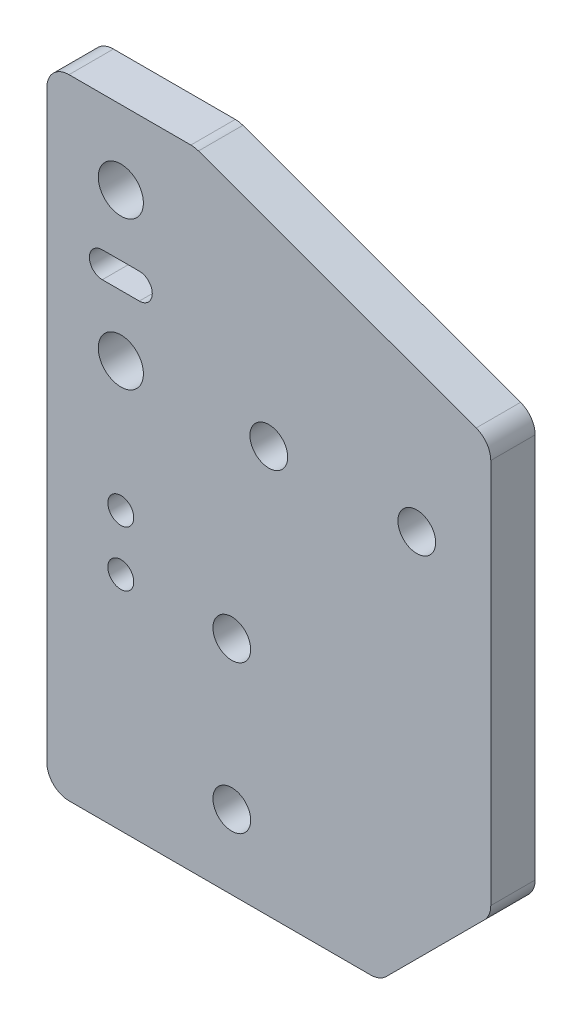
ISO-10303-21;
HEADER;
FILE_DESCRIPTION(('STEP AP214'),'2;1');
FILE_NAME('part.step','',(''),(''),'','','');
FILE_SCHEMA(('AUTOMOTIVE_DESIGN { 1 0 10303 214 1 1 1 1 }'));
ENDSEC;
DATA;
#1=APPLICATION_CONTEXT('core data for automotive mechanical design processes');
#2=APPLICATION_PROTOCOL_DEFINITION('international standard','automotive_design',2000,#1);
#3=PRODUCT_CONTEXT('',#1,'mechanical');
#4=PRODUCT('Part','Part','',(#3));
#5=PRODUCT_RELATED_PRODUCT_CATEGORY('part','',(#4));
#6=PRODUCT_DEFINITION_FORMATION('','',#4);
#7=PRODUCT_DEFINITION_CONTEXT('part definition',#1,'design');
#8=PRODUCT_DEFINITION('design','',#6,#7);
#9=PRODUCT_DEFINITION_SHAPE('','',#8);
#10=(LENGTH_UNIT() NAMED_UNIT(*) SI_UNIT(.MILLI.,.METRE.));
#11=(NAMED_UNIT(*) PLANE_ANGLE_UNIT() SI_UNIT($,.RADIAN.));
#12=(NAMED_UNIT(*) SI_UNIT($,.STERADIAN.) SOLID_ANGLE_UNIT());
#13=UNCERTAINTY_MEASURE_WITH_UNIT(LENGTH_MEASURE(1.E-05),#10,'distance_accuracy_value','');
#14=(GEOMETRIC_REPRESENTATION_CONTEXT(3) GLOBAL_UNCERTAINTY_ASSIGNED_CONTEXT((#13)) GLOBAL_UNIT_ASSIGNED_CONTEXT((#10,
#11,#12)) REPRESENTATION_CONTEXT('',''));
#15=CARTESIAN_POINT('',(0.,0.,0.));
#16=DIRECTION('',(0.,0.,1.));
#17=DIRECTION('',(1.,0.,0.));
#18=AXIS2_PLACEMENT_3D('',#15,#16,#17);
#19=CARTESIAN_POINT('',(57.,16.2426406871195,0.));
#20=DIRECTION('',(0.,0.,-1.));
#21=DIRECTION('',(-1.,0.,0.));
#22=AXIS2_PLACEMENT_3D('',#19,#20,#21);
#23=PLANE('',#22);
#24=CARTESIAN_POINT('',(25.,9.99999999999999,0.));
#25=DIRECTION('',(0.,0.,1.));
#26=DIRECTION('',(1.,0.,0.));
#27=AXIS2_PLACEMENT_3D('',#24,#25,#26);
#28=CIRCLE('',#27,2.55);
#29=CARTESIAN_POINT('',(27.55,9.99999999999999,0.));
#30=VERTEX_POINT('',#29);
#31=EDGE_CURVE('E569',#30,#30,#28,.T.);
#32=ORIENTED_EDGE('',*,*,#31,.T.);
#33=EDGE_LOOP('',(#32));
#34=FACE_BOUND('',#33,.T.);
#35=CARTESIAN_POINT('',(50.,55.,0.));
#36=DIRECTION('',(0.,0.,1.));
#37=DIRECTION('',(1.,0.,0.));
#38=AXIS2_PLACEMENT_3D('',#35,#36,#37);
#39=CIRCLE('',#38,2.55);
#40=CARTESIAN_POINT('',(52.55,55.,0.));
#41=VERTEX_POINT('',#40);
#42=EDGE_CURVE('E594',#41,#41,#39,.T.);
#43=ORIENTED_EDGE('',*,*,#42,.T.);
#44=EDGE_LOOP('',(#43));
#45=FACE_BOUND('',#44,.T.);
#46=DIRECTION('',(1.,0.,0.));
#47=VECTOR('',#46,1.);
#48=CARTESIAN_POINT('',(12.5,63.25,0.));
#49=LINE('',#48,#47);
#50=CARTESIAN_POINT('',(7.49999999999999,63.25,0.));
#51=VERTEX_POINT('',#50);
#52=CARTESIAN_POINT('',(12.5,63.25,0.));
#53=VERTEX_POINT('',#52);
#54=EDGE_CURVE('E156',#51,#53,#49,.T.);
#55=ORIENTED_EDGE('',*,*,#54,.T.);
#56=CARTESIAN_POINT('',(12.5,65.,0.));
#57=DIRECTION('',(0.,0.,1.));
#58=DIRECTION('',(1.,0.,0.));
#59=AXIS2_PLACEMENT_3D('',#56,#57,#58);
#60=CIRCLE('',#59,1.75);
#61=CARTESIAN_POINT('',(12.5,66.75,0.));
#62=VERTEX_POINT('',#61);
#63=EDGE_CURVE('E57',#53,#62,#60,.T.);
#64=ORIENTED_EDGE('',*,*,#63,.T.);
#65=DIRECTION('',(-1.,0.,0.));
#66=VECTOR('',#65,1.);
#67=CARTESIAN_POINT('',(12.5,66.75,0.));
#68=LINE('',#67,#66);
#69=CARTESIAN_POINT('',(7.49999999999999,66.75,0.));
#70=VERTEX_POINT('',#69);
#71=EDGE_CURVE('E162',#62,#70,#68,.T.);
#72=ORIENTED_EDGE('',*,*,#71,.T.);
#73=CARTESIAN_POINT('',(7.49999999999999,65.,0.));
#74=DIRECTION('',(0.,0.,1.));
#75=DIRECTION('',(1.,0.,0.));
#76=AXIS2_PLACEMENT_3D('',#73,#74,#75);
#77=CIRCLE('',#76,1.75);
#78=EDGE_CURVE('E179',#70,#51,#77,.T.);
#79=ORIENTED_EDGE('',*,*,#78,.T.);
#80=EDGE_LOOP('',(#55,#64,#72,#79));
#81=FACE_BOUND('',#80,.T.);
#82=CARTESIAN_POINT('',(10.,55.,0.));
#83=DIRECTION('',(0.,0.,1.));
#84=DIRECTION('',(1.,0.,0.));
#85=AXIS2_PLACEMENT_3D('',#82,#83,#84);
#86=CIRCLE('',#85,3.05);
#87=CARTESIAN_POINT('',(13.05,55.,0.));
#88=VERTEX_POINT('',#87);
#89=EDGE_CURVE('E163',#88,#88,#86,.T.);
#90=ORIENTED_EDGE('',*,*,#89,.T.);
#91=EDGE_LOOP('',(#90));
#92=FACE_BOUND('',#91,.T.);
#93=CARTESIAN_POINT('',(57.,16.2426406871195,0.));
#94=DIRECTION('',(0.,0.,1.));
#95=DIRECTION('',(-1.,0.,0.));
#96=AXIS2_PLACEMENT_3D('',#93,#94,#95);
#97=CIRCLE('',#96,2.99999999999999);
#98=CARTESIAN_POINT('',(59.1213203435597,14.1213203435598,0.));
#99=VERTEX_POINT('',#98);
#100=CARTESIAN_POINT('',(60.,16.2426406871195,0.));
#101=VERTEX_POINT('',#100);
#102=EDGE_CURVE('E196',#99,#101,#97,.T.);
#103=ORIENTED_EDGE('',*,*,#102,.F.);
#104=DIRECTION('',(0.707106781186543,0.707106781186551,0.));
#105=VECTOR('',#104,1.);
#106=CARTESIAN_POINT('',(59.1213203435597,14.1213203435598,0.));
#107=LINE('',#106,#105);
#108=CARTESIAN_POINT('',(45.8786796564404,0.87867965644037,0.));
#109=VERTEX_POINT('',#108);
#110=EDGE_CURVE('E203',#109,#99,#107,.T.);
#111=ORIENTED_EDGE('',*,*,#110,.F.);
#112=CARTESIAN_POINT('',(43.7573593128807,3.,0.));
#113=DIRECTION('',(0.,0.,1.));
#114=DIRECTION('',(-1.,0.,0.));
#115=AXIS2_PLACEMENT_3D('',#112,#113,#114);
#116=CIRCLE('',#115,3.);
#117=CARTESIAN_POINT('',(43.7573593128807,0.,0.));
#118=VERTEX_POINT('',#117);
#119=EDGE_CURVE('E246',#118,#109,#116,.T.);
#120=ORIENTED_EDGE('',*,*,#119,.F.);
#121=DIRECTION('',(1.,0.,0.));
#122=VECTOR('',#121,1.);
#123=CARTESIAN_POINT('',(3.00000000000002,0.,0.));
#124=LINE('',#123,#122);
#125=CARTESIAN_POINT('',(3.00000000000002,0.,0.));
#126=VERTEX_POINT('',#125);
#127=EDGE_CURVE('E244',#126,#118,#124,.T.);
#128=ORIENTED_EDGE('',*,*,#127,.F.);
#129=CARTESIAN_POINT('',(3.,3.,0.));
#130=DIRECTION('',(0.,0.,1.));
#131=DIRECTION('',(1.,0.,0.));
#132=AXIS2_PLACEMENT_3D('',#129,#130,#131);
#133=CIRCLE('',#132,3.);
#134=CARTESIAN_POINT('',(0.,3.00000000000002,0.));
#135=VERTEX_POINT('',#134);
#136=EDGE_CURVE('E242',#135,#126,#133,.T.);
#137=ORIENTED_EDGE('',*,*,#136,.F.);
#138=DIRECTION('',(0.,-1.,0.));
#139=VECTOR('',#138,1.);
#140=CARTESIAN_POINT('',(0.,3.00000000000002,0.));
#141=LINE('',#140,#139);
#142=CARTESIAN_POINT('',(0.,82.,0.));
#143=VERTEX_POINT('',#142);
#144=EDGE_CURVE('E240',#143,#135,#141,.T.);
#145=ORIENTED_EDGE('',*,*,#144,.F.);
#146=CARTESIAN_POINT('',(3.,82.,0.));
#147=DIRECTION('',(0.,0.,1.));
#148=DIRECTION('',(-1.,0.,0.));
#149=AXIS2_PLACEMENT_3D('',#146,#147,#148);
#150=CIRCLE('',#149,3.);
#151=CARTESIAN_POINT('',(3.,85.,0.));
#152=VERTEX_POINT('',#151);
#153=EDGE_CURVE('E238',#152,#143,#150,.T.);
#154=ORIENTED_EDGE('',*,*,#153,.F.);
#155=DIRECTION('',(-1.,0.,0.));
#156=VECTOR('',#155,1.);
#157=CARTESIAN_POINT('',(3.,85.,0.));
#158=LINE('',#157,#156);
#159=CARTESIAN_POINT('',(19.4710190578746,85.,0.));
#160=VERTEX_POINT('',#159);
#161=EDGE_CURVE('E236',#160,#152,#158,.T.);
#162=ORIENTED_EDGE('',*,*,#161,.F.);
#163=CARTESIAN_POINT('',(19.4710190578746,82.,0.));
#164=DIRECTION('',(0.,0.,1.));
#165=DIRECTION('',(1.,0.,0.));
#166=AXIS2_PLACEMENT_3D('',#163,#164,#165);
#167=CIRCLE('',#166,3.00000000000001);
#168=CARTESIAN_POINT('',(20.4970794878516,84.8190778623577,0.));
#169=VERTEX_POINT('',#168);
#170=EDGE_CURVE('E234',#169,#160,#167,.T.);
#171=ORIENTED_EDGE('',*,*,#170,.F.);
#172=DIRECTION('',(-0.939692620785909,0.342020143325666,0.));
#173=VECTOR('',#172,1.);
#174=CARTESIAN_POINT('',(58.026060429977,71.1596458770806,0.));
#175=LINE('',#174,#173);
#176=CARTESIAN_POINT('',(58.026060429977,71.1596458770806,0.));
#177=VERTEX_POINT('',#176);
#178=EDGE_CURVE('E232',#177,#169,#175,.T.);
#179=ORIENTED_EDGE('',*,*,#178,.F.);
#180=CARTESIAN_POINT('',(57.,68.3405680147229,0.));
#181=DIRECTION('',(0.,0.,1.));
#182=DIRECTION('',(-1.,0.,0.));
#183=AXIS2_PLACEMENT_3D('',#180,#181,#182);
#184=CIRCLE('',#183,3.);
#185=CARTESIAN_POINT('',(60.,68.3405680147229,0.));
#186=VERTEX_POINT('',#185);
#187=EDGE_CURVE('E230',#186,#177,#184,.T.);
#188=ORIENTED_EDGE('',*,*,#187,.F.);
#189=DIRECTION('',(0.,1.,0.));
#190=VECTOR('',#189,1.);
#191=CARTESIAN_POINT('',(60.,16.2426406871195,0.));
#192=LINE('',#191,#190);
#193=EDGE_CURVE('E228',#101,#186,#192,.T.);
#194=ORIENTED_EDGE('',*,*,#193,.F.);
#195=EDGE_LOOP('',(#103,#111,#120,#128,#137,#145,#154,#162,#171,#179,#188,#194));
#196=FACE_BOUND('',#195,.T.);
#197=CARTESIAN_POINT('',(9.99999999999999,75.,0.));
#198=DIRECTION('',(0.,0.,1.));
#199=DIRECTION('',(1.,0.,0.));
#200=AXIS2_PLACEMENT_3D('',#197,#198,#199);
#201=CIRCLE('',#200,3.05);
#202=CARTESIAN_POINT('',(13.05,75.,0.));
#203=VERTEX_POINT('',#202);
#204=EDGE_CURVE('E190',#203,#203,#201,.T.);
#205=ORIENTED_EDGE('',*,*,#204,.T.);
#206=EDGE_LOOP('',(#205));
#207=FACE_BOUND('',#206,.T.);
#208=CARTESIAN_POINT('',(30.,55.,0.));
#209=DIRECTION('',(0.,0.,1.));
#210=DIRECTION('',(1.,0.,0.));
#211=AXIS2_PLACEMENT_3D('',#208,#209,#210);
#212=CIRCLE('',#211,2.55);
#213=CARTESIAN_POINT('',(32.55,55.,0.));
#214=VERTEX_POINT('',#213);
#215=EDGE_CURVE('E598',#214,#214,#212,.T.);
#216=ORIENTED_EDGE('',*,*,#215,.T.);
#217=EDGE_LOOP('',(#216));
#218=FACE_BOUND('',#217,.T.);
#219=CARTESIAN_POINT('',(10.,30.,0.));
#220=DIRECTION('',(0.,0.,-1.));
#221=DIRECTION('',(-1.,0.,0.));
#222=AXIS2_PLACEMENT_3D('',#219,#220,#221);
#223=CIRCLE('',#222,1.75);
#224=CARTESIAN_POINT('',(8.25,30.,0.));
#225=VERTEX_POINT('',#224);
#226=EDGE_CURVE('E588',#225,#225,#223,.T.);
#227=ORIENTED_EDGE('',*,*,#226,.F.);
#228=EDGE_LOOP('',(#227));
#229=FACE_BOUND('',#228,.T.);
#230=CARTESIAN_POINT('',(10.,37.5,0.));
#231=DIRECTION('',(0.,0.,-1.));
#232=DIRECTION('',(-1.,0.,0.));
#233=AXIS2_PLACEMENT_3D('',#230,#231,#232);
#234=CIRCLE('',#233,1.75);
#235=CARTESIAN_POINT('',(8.25,37.5,0.));
#236=VERTEX_POINT('',#235);
#237=EDGE_CURVE('E582',#236,#236,#234,.T.);
#238=ORIENTED_EDGE('',*,*,#237,.F.);
#239=EDGE_LOOP('',(#238));
#240=FACE_BOUND('',#239,.T.);
#241=CARTESIAN_POINT('',(25.,30.,0.));
#242=DIRECTION('',(0.,0.,1.));
#243=DIRECTION('',(1.,0.,0.));
#244=AXIS2_PLACEMENT_3D('',#241,#242,#243);
#245=CIRCLE('',#244,2.55);
#246=CARTESIAN_POINT('',(27.55,30.,0.));
#247=VERTEX_POINT('',#246);
#248=EDGE_CURVE('E579',#247,#247,#245,.T.);
#249=ORIENTED_EDGE('',*,*,#248,.T.);
#250=EDGE_LOOP('',(#249));
#251=FACE_BOUND('',#250,.T.);
#252=ADVANCED_FACE('F34',(#34,#45,#81,#92,#196,#207,#218,#229,#240,#251),#23,.T.);
#253=CARTESIAN_POINT('',(57.,16.2426406871195,6.));
#254=DIRECTION('',(0.,0.,-1.));
#255=DIRECTION('',(-1.,0.,0.));
#256=AXIS2_PLACEMENT_3D('',#253,#254,#255);
#257=PLANE('',#256);
#258=CARTESIAN_POINT('',(25.,9.99999999999999,6.));
#259=DIRECTION('',(0.,0.,1.));
#260=DIRECTION('',(1.,0.,0.));
#261=AXIS2_PLACEMENT_3D('',#258,#259,#260);
#262=CIRCLE('',#261,2.55);
#263=CARTESIAN_POINT('',(27.55,9.99999999999999,6.));
#264=VERTEX_POINT('',#263);
#265=EDGE_CURVE('E572',#264,#264,#262,.T.);
#266=ORIENTED_EDGE('',*,*,#265,.F.);
#267=EDGE_LOOP('',(#266));
#268=FACE_BOUND('',#267,.T.);
#269=CARTESIAN_POINT('',(25.,30.,6.));
#270=DIRECTION('',(0.,0.,1.));
#271=DIRECTION('',(1.,0.,0.));
#272=AXIS2_PLACEMENT_3D('',#269,#270,#271);
#273=CIRCLE('',#272,2.55);
#274=CARTESIAN_POINT('',(27.55,30.,6.));
#275=VERTEX_POINT('',#274);
#276=EDGE_CURVE('E574',#275,#275,#273,.T.);
#277=ORIENTED_EDGE('',*,*,#276,.F.);
#278=EDGE_LOOP('',(#277));
#279=FACE_BOUND('',#278,.T.);
#280=CARTESIAN_POINT('',(10.,37.5,6.));
#281=DIRECTION('',(0.,0.,-1.));
#282=DIRECTION('',(-1.,0.,0.));
#283=AXIS2_PLACEMENT_3D('',#280,#281,#282);
#284=CIRCLE('',#283,1.75);
#285=CARTESIAN_POINT('',(8.25,37.5,6.));
#286=VERTEX_POINT('',#285);
#287=EDGE_CURVE('E585',#286,#286,#284,.T.);
#288=ORIENTED_EDGE('',*,*,#287,.T.);
#289=EDGE_LOOP('',(#288));
#290=FACE_BOUND('',#289,.T.);
#291=CARTESIAN_POINT('',(10.,30.,6.));
#292=DIRECTION('',(0.,0.,-1.));
#293=DIRECTION('',(-1.,0.,0.));
#294=AXIS2_PLACEMENT_3D('',#291,#292,#293);
#295=CIRCLE('',#294,1.75);
#296=CARTESIAN_POINT('',(8.25,30.,6.));
#297=VERTEX_POINT('',#296);
#298=EDGE_CURVE('E591',#297,#297,#295,.T.);
#299=ORIENTED_EDGE('',*,*,#298,.T.);
#300=EDGE_LOOP('',(#299));
#301=FACE_BOUND('',#300,.T.);
#302=CARTESIAN_POINT('',(10.,55.,6.));
#303=DIRECTION('',(0.,0.,1.));
#304=DIRECTION('',(1.,0.,0.));
#305=AXIS2_PLACEMENT_3D('',#302,#303,#304);
#306=CIRCLE('',#305,3.05);
#307=CARTESIAN_POINT('',(13.05,55.,6.));
#308=VERTEX_POINT('',#307);
#309=EDGE_CURVE('E187',#308,#308,#306,.T.);
#310=ORIENTED_EDGE('',*,*,#309,.F.);
#311=EDGE_LOOP('',(#310));
#312=FACE_BOUND('',#311,.T.);
#313=CARTESIAN_POINT('',(9.99999999999999,75.,6.));
#314=DIRECTION('',(0.,0.,1.));
#315=DIRECTION('',(1.,0.,0.));
#316=AXIS2_PLACEMENT_3D('',#313,#314,#315);
#317=CIRCLE('',#316,3.05);
#318=CARTESIAN_POINT('',(13.05,75.,6.));
#319=VERTEX_POINT('',#318);
#320=EDGE_CURVE('E193',#319,#319,#317,.T.);
#321=ORIENTED_EDGE('',*,*,#320,.F.);
#322=EDGE_LOOP('',(#321));
#323=FACE_BOUND('',#322,.T.);
#324=CARTESIAN_POINT('',(57.,16.2426406871195,6.));
#325=DIRECTION('',(0.,0.,1.));
#326=DIRECTION('',(-1.,0.,0.));
#327=AXIS2_PLACEMENT_3D('',#324,#325,#326);
#328=CIRCLE('',#327,2.99999999999999);
#329=CARTESIAN_POINT('',(59.1213203435597,14.1213203435598,6.));
#330=VERTEX_POINT('',#329);
#331=CARTESIAN_POINT('',(60.,16.2426406871195,6.));
#332=VERTEX_POINT('',#331);
#333=EDGE_CURVE('E199',#330,#332,#328,.T.);
#334=ORIENTED_EDGE('',*,*,#333,.T.);
#335=DIRECTION('',(0.,1.,0.));
#336=VECTOR('',#335,1.);
#337=CARTESIAN_POINT('',(60.,16.2426406871195,6.));
#338=LINE('',#337,#336);
#339=CARTESIAN_POINT('',(60.,68.3405680147229,6.));
#340=VERTEX_POINT('',#339);
#341=EDGE_CURVE('E202',#332,#340,#338,.T.);
#342=ORIENTED_EDGE('',*,*,#341,.T.);
#343=CARTESIAN_POINT('',(57.,68.3405680147229,6.));
#344=DIRECTION('',(0.,0.,1.));
#345=DIRECTION('',(-1.,0.,0.));
#346=AXIS2_PLACEMENT_3D('',#343,#344,#345);
#347=CIRCLE('',#346,3.);
#348=CARTESIAN_POINT('',(58.026060429977,71.1596458770806,6.));
#349=VERTEX_POINT('',#348);
#350=EDGE_CURVE('E205',#340,#349,#347,.T.);
#351=ORIENTED_EDGE('',*,*,#350,.T.);
#352=DIRECTION('',(-0.939692620785909,0.342020143325666,0.));
#353=VECTOR('',#352,1.);
#354=CARTESIAN_POINT('',(58.026060429977,71.1596458770806,6.));
#355=LINE('',#354,#353);
#356=CARTESIAN_POINT('',(20.4970794878516,84.8190778623577,6.));
#357=VERTEX_POINT('',#356);
#358=EDGE_CURVE('E207',#349,#357,#355,.T.);
#359=ORIENTED_EDGE('',*,*,#358,.T.);
#360=CARTESIAN_POINT('',(19.4710190578746,82.,6.));
#361=DIRECTION('',(0.,0.,1.));
#362=DIRECTION('',(1.,0.,0.));
#363=AXIS2_PLACEMENT_3D('',#360,#361,#362);
#364=CIRCLE('',#363,3.00000000000001);
#365=CARTESIAN_POINT('',(19.4710190578746,85.,6.));
#366=VERTEX_POINT('',#365);
#367=EDGE_CURVE('E209',#357,#366,#364,.T.);
#368=ORIENTED_EDGE('',*,*,#367,.T.);
#369=DIRECTION('',(-1.,0.,0.));
#370=VECTOR('',#369,1.);
#371=CARTESIAN_POINT('',(3.,85.,6.));
#372=LINE('',#371,#370);
#373=CARTESIAN_POINT('',(3.,85.,6.));
#374=VERTEX_POINT('',#373);
#375=EDGE_CURVE('E211',#366,#374,#372,.T.);
#376=ORIENTED_EDGE('',*,*,#375,.T.);
#377=CARTESIAN_POINT('',(3.,82.,6.));
#378=DIRECTION('',(0.,0.,1.));
#379=DIRECTION('',(-1.,0.,0.));
#380=AXIS2_PLACEMENT_3D('',#377,#378,#379);
#381=CIRCLE('',#380,3.);
#382=CARTESIAN_POINT('',(0.,82.,6.));
#383=VERTEX_POINT('',#382);
#384=EDGE_CURVE('E213',#374,#383,#381,.T.);
#385=ORIENTED_EDGE('',*,*,#384,.T.);
#386=DIRECTION('',(0.,-1.,0.));
#387=VECTOR('',#386,1.);
#388=CARTESIAN_POINT('',(0.,3.00000000000002,6.));
#389=LINE('',#388,#387);
#390=CARTESIAN_POINT('',(0.,3.00000000000002,6.));
#391=VERTEX_POINT('',#390);
#392=EDGE_CURVE('E215',#383,#391,#389,.T.);
#393=ORIENTED_EDGE('',*,*,#392,.T.);
#394=CARTESIAN_POINT('',(3.,3.,6.));
#395=DIRECTION('',(0.,0.,1.));
#396=DIRECTION('',(1.,0.,0.));
#397=AXIS2_PLACEMENT_3D('',#394,#395,#396);
#398=CIRCLE('',#397,3.);
#399=CARTESIAN_POINT('',(3.00000000000002,0.,6.));
#400=VERTEX_POINT('',#399);
#401=EDGE_CURVE('E217',#391,#400,#398,.T.);
#402=ORIENTED_EDGE('',*,*,#401,.T.);
#403=DIRECTION('',(1.,0.,0.));
#404=VECTOR('',#403,1.);
#405=CARTESIAN_POINT('',(3.00000000000002,0.,6.));
#406=LINE('',#405,#404);
#407=CARTESIAN_POINT('',(43.7573593128807,0.,6.));
#408=VERTEX_POINT('',#407);
#409=EDGE_CURVE('E219',#400,#408,#406,.T.);
#410=ORIENTED_EDGE('',*,*,#409,.T.);
#411=CARTESIAN_POINT('',(43.7573593128807,3.,6.));
#412=DIRECTION('',(0.,0.,1.));
#413=DIRECTION('',(-1.,0.,0.));
#414=AXIS2_PLACEMENT_3D('',#411,#412,#413);
#415=CIRCLE('',#414,3.);
#416=CARTESIAN_POINT('',(45.8786796564404,0.87867965644037,6.));
#417=VERTEX_POINT('',#416);
#418=EDGE_CURVE('E221',#408,#417,#415,.T.);
#419=ORIENTED_EDGE('',*,*,#418,.T.);
#420=DIRECTION('',(0.707106781186543,0.707106781186551,0.));
#421=VECTOR('',#420,1.);
#422=CARTESIAN_POINT('',(59.1213203435597,14.1213203435598,6.));
#423=LINE('',#422,#421);
#424=EDGE_CURVE('E223',#417,#330,#423,.T.);
#425=ORIENTED_EDGE('',*,*,#424,.T.);
#426=EDGE_LOOP('',(#334,#342,#351,#359,#368,#376,#385,#393,#402,#410,#419,#425));
#427=FACE_BOUND('',#426,.T.);
#428=CARTESIAN_POINT('',(12.5,65.,6.));
#429=DIRECTION('',(0.,0.,1.));
#430=DIRECTION('',(1.,0.,0.));
#431=AXIS2_PLACEMENT_3D('',#428,#429,#430);
#432=CIRCLE('',#431,1.75);
#433=CARTESIAN_POINT('',(12.5,63.25,6.));
#434=VERTEX_POINT('',#433);
#435=CARTESIAN_POINT('',(12.5,66.75,6.));
#436=VERTEX_POINT('',#435);
#437=EDGE_CURVE('E147',#434,#436,#432,.T.);
#438=ORIENTED_EDGE('',*,*,#437,.F.);
#439=DIRECTION('',(1.,0.,0.));
#440=VECTOR('',#439,1.);
#441=CARTESIAN_POINT('',(12.5,63.25,6.));
#442=LINE('',#441,#440);
#443=CARTESIAN_POINT('',(7.49999999999999,63.25,6.));
#444=VERTEX_POINT('',#443);
#445=EDGE_CURVE('E171',#444,#434,#442,.T.);
#446=ORIENTED_EDGE('',*,*,#445,.F.);
#447=CARTESIAN_POINT('',(7.49999999999999,65.,6.));
#448=DIRECTION('',(0.,0.,1.));
#449=DIRECTION('',(1.,0.,0.));
#450=AXIS2_PLACEMENT_3D('',#447,#448,#449);
#451=CIRCLE('',#450,1.75);
#452=CARTESIAN_POINT('',(7.49999999999999,66.75,6.));
#453=VERTEX_POINT('',#452);
#454=EDGE_CURVE('E169',#453,#444,#451,.T.);
#455=ORIENTED_EDGE('',*,*,#454,.F.);
#456=DIRECTION('',(-1.,0.,0.));
#457=VECTOR('',#456,1.);
#458=CARTESIAN_POINT('',(12.5,66.75,6.));
#459=LINE('',#458,#457);
#460=EDGE_CURVE('E155',#436,#453,#459,.T.);
#461=ORIENTED_EDGE('',*,*,#460,.F.);
#462=EDGE_LOOP('',(#438,#446,#455,#461));
#463=FACE_BOUND('',#462,.T.);
#464=CARTESIAN_POINT('',(30.,55.,6.));
#465=DIRECTION('',(0.,0.,1.));
#466=DIRECTION('',(1.,0.,0.));
#467=AXIS2_PLACEMENT_3D('',#464,#465,#466);
#468=CIRCLE('',#467,2.55);
#469=CARTESIAN_POINT('',(32.55,55.,6.));
#470=VERTEX_POINT('',#469);
#471=EDGE_CURVE('E177',#470,#470,#468,.T.);
#472=ORIENTED_EDGE('',*,*,#471,.F.);
#473=EDGE_LOOP('',(#472));
#474=FACE_BOUND('',#473,.T.);
#475=CARTESIAN_POINT('',(50.,55.,6.));
#476=DIRECTION('',(0.,0.,1.));
#477=DIRECTION('',(1.,0.,0.));
#478=AXIS2_PLACEMENT_3D('',#475,#476,#477);
#479=CIRCLE('',#478,2.55);
#480=CARTESIAN_POINT('',(52.55,55.,6.));
#481=VERTEX_POINT('',#480);
#482=EDGE_CURVE('E595',#481,#481,#479,.T.);
#483=ORIENTED_EDGE('',*,*,#482,.F.);
#484=EDGE_LOOP('',(#483));
#485=FACE_BOUND('',#484,.T.);
#486=ADVANCED_FACE('F167',(#268,#279,#290,#301,#312,#323,#427,#463,#474,#485),#257,.F.);
#487=CARTESIAN_POINT('',(57.,16.2426406871195,6.));
#488=DIRECTION('',(0.,0.,-1.));
#489=DIRECTION('',(-1.,0.,0.));
#490=AXIS2_PLACEMENT_3D('',#487,#488,#489);
#491=CYLINDRICAL_SURFACE('',#490,2.99999999999999);
#492=ORIENTED_EDGE('',*,*,#102,.T.);
#493=DIRECTION('',(0.,0.,-1.));
#494=VECTOR('',#493,1.);
#495=CARTESIAN_POINT('',(60.,16.2426406871195,6.));
#496=LINE('',#495,#494);
#497=EDGE_CURVE('E11',#332,#101,#496,.T.);
#498=ORIENTED_EDGE('',*,*,#497,.F.);
#499=ORIENTED_EDGE('',*,*,#333,.F.);
#500=DIRECTION('',(0.,0.,-1.));
#501=VECTOR('',#500,1.);
#502=CARTESIAN_POINT('',(59.1213203435597,14.1213203435598,6.));
#503=LINE('',#502,#501);
#504=EDGE_CURVE('E225',#330,#99,#503,.T.);
#505=ORIENTED_EDGE('',*,*,#504,.T.);
#506=EDGE_LOOP('',(#492,#498,#499,#505));
#507=FACE_BOUND('',#506,.T.);
#508=ADVANCED_FACE('F36',(#507),#491,.T.);
#509=CARTESIAN_POINT('',(60.,16.2426406871195,6.));
#510=DIRECTION('',(-1.,0.,0.));
#511=DIRECTION('',(0.,-1.,0.));
#512=AXIS2_PLACEMENT_3D('',#509,#510,#511);
#513=PLANE('',#512);
#514=ORIENTED_EDGE('',*,*,#193,.T.);
#515=DIRECTION('',(0.,0.,-1.));
#516=VECTOR('',#515,1.);
#517=CARTESIAN_POINT('',(60.,68.3405680147229,6.));
#518=LINE('',#517,#516);
#519=EDGE_CURVE('E42',#340,#186,#518,.T.);
#520=ORIENTED_EDGE('',*,*,#519,.F.);
#521=ORIENTED_EDGE('',*,*,#341,.F.);
#522=ORIENTED_EDGE('',*,*,#497,.T.);
#523=EDGE_LOOP('',(#514,#520,#521,#522));
#524=FACE_BOUND('',#523,.T.);
#525=ADVANCED_FACE('F304',(#524),#513,.F.);
#526=CARTESIAN_POINT('',(57.,68.3405680147229,6.));
#527=DIRECTION('',(0.,0.,-1.));
#528=DIRECTION('',(-1.,0.,0.));
#529=AXIS2_PLACEMENT_3D('',#526,#527,#528);
#530=CYLINDRICAL_SURFACE('',#529,3.);
#531=ORIENTED_EDGE('',*,*,#187,.T.);
#532=DIRECTION('',(0.,0.,-1.));
#533=VECTOR('',#532,1.);
#534=CARTESIAN_POINT('',(58.026060429977,71.1596458770806,6.));
#535=LINE('',#534,#533);
#536=EDGE_CURVE('E275',#349,#177,#535,.T.);
#537=ORIENTED_EDGE('',*,*,#536,.F.);
#538=ORIENTED_EDGE('',*,*,#350,.F.);
#539=ORIENTED_EDGE('',*,*,#519,.T.);
#540=EDGE_LOOP('',(#531,#537,#538,#539));
#541=FACE_BOUND('',#540,.T.);
#542=ADVANCED_FACE('F282',(#541),#530,.T.);
#543=CARTESIAN_POINT('',(58.026060429977,71.1596458770806,6.));
#544=DIRECTION('',(-0.342020143325666,-0.939692620785909,0.));
#545=DIRECTION('',(0.939692620785909,-0.342020143325666,0.));
#546=AXIS2_PLACEMENT_3D('',#543,#544,#545);
#547=PLANE('',#546);
#548=ORIENTED_EDGE('',*,*,#178,.T.);
#549=DIRECTION('',(0.,0.,-1.));
#550=VECTOR('',#549,1.);
#551=CARTESIAN_POINT('',(20.4970794878516,84.8190778623577,6.));
#552=LINE('',#551,#550);
#553=EDGE_CURVE('E272',#357,#169,#552,.T.);
#554=ORIENTED_EDGE('',*,*,#553,.F.);
#555=ORIENTED_EDGE('',*,*,#358,.F.);
#556=ORIENTED_EDGE('',*,*,#536,.T.);
#557=EDGE_LOOP('',(#548,#554,#555,#556));
#558=FACE_BOUND('',#557,.T.);
#559=ADVANCED_FACE('F293',(#558),#547,.F.);
#560=CARTESIAN_POINT('',(19.4710190578746,82.,6.));
#561=DIRECTION('',(0.,0.,-1.));
#562=DIRECTION('',(-1.,0.,0.));
#563=AXIS2_PLACEMENT_3D('',#560,#561,#562);
#564=CYLINDRICAL_SURFACE('',#563,3.00000000000001);
#565=ORIENTED_EDGE('',*,*,#170,.T.);
#566=DIRECTION('',(0.,0.,-1.));
#567=VECTOR('',#566,1.);
#568=CARTESIAN_POINT('',(19.4710190578746,85.,6.));
#569=LINE('',#568,#567);
#570=EDGE_CURVE('E269',#366,#160,#569,.T.);
#571=ORIENTED_EDGE('',*,*,#570,.F.);
#572=ORIENTED_EDGE('',*,*,#367,.F.);
#573=ORIENTED_EDGE('',*,*,#553,.T.);
#574=EDGE_LOOP('',(#565,#571,#572,#573));
#575=FACE_BOUND('',#574,.T.);
#576=ADVANCED_FACE('F297',(#575),#564,.T.);
#577=CARTESIAN_POINT('',(3.,85.,6.));
#578=DIRECTION('',(0.,-1.,0.));
#579=DIRECTION('',(1.,0.,0.));
#580=AXIS2_PLACEMENT_3D('',#577,#578,#579);
#581=PLANE('',#580);
#582=ORIENTED_EDGE('',*,*,#161,.T.);
#583=DIRECTION('',(0.,0.,-1.));
#584=VECTOR('',#583,1.);
#585=CARTESIAN_POINT('',(3.,85.,6.));
#586=LINE('',#585,#584);
#587=EDGE_CURVE('E266',#374,#152,#586,.T.);
#588=ORIENTED_EDGE('',*,*,#587,.F.);
#589=ORIENTED_EDGE('',*,*,#375,.F.);
#590=ORIENTED_EDGE('',*,*,#570,.T.);
#591=EDGE_LOOP('',(#582,#588,#589,#590));
#592=FACE_BOUND('',#591,.T.);
#593=ADVANCED_FACE('F337',(#592),#581,.F.);
#594=CARTESIAN_POINT('',(3.,82.,6.));
#595=DIRECTION('',(0.,0.,-1.));
#596=DIRECTION('',(-1.,0.,0.));
#597=AXIS2_PLACEMENT_3D('',#594,#595,#596);
#598=CYLINDRICAL_SURFACE('',#597,3.);
#599=ORIENTED_EDGE('',*,*,#153,.T.);
#600=DIRECTION('',(0.,0.,-1.));
#601=VECTOR('',#600,1.);
#602=CARTESIAN_POINT('',(0.,82.,6.));
#603=LINE('',#602,#601);
#604=EDGE_CURVE('E263',#383,#143,#603,.T.);
#605=ORIENTED_EDGE('',*,*,#604,.F.);
#606=ORIENTED_EDGE('',*,*,#384,.F.);
#607=ORIENTED_EDGE('',*,*,#587,.T.);
#608=EDGE_LOOP('',(#599,#605,#606,#607));
#609=FACE_BOUND('',#608,.T.);
#610=ADVANCED_FACE('F335',(#609),#598,.T.);
#611=CARTESIAN_POINT('',(0.,3.00000000000002,6.));
#612=DIRECTION('',(1.,0.,0.));
#613=DIRECTION('',(0.,0.,-1.));
#614=AXIS2_PLACEMENT_3D('',#611,#612,#613);
#615=PLANE('',#614);
#616=ORIENTED_EDGE('',*,*,#144,.T.);
#617=DIRECTION('',(0.,0.,-1.));
#618=VECTOR('',#617,1.);
#619=CARTESIAN_POINT('',(0.,3.00000000000002,6.));
#620=LINE('',#619,#618);
#621=EDGE_CURVE('E260',#391,#135,#620,.T.);
#622=ORIENTED_EDGE('',*,*,#621,.F.);
#623=ORIENTED_EDGE('',*,*,#392,.F.);
#624=ORIENTED_EDGE('',*,*,#604,.T.);
#625=EDGE_LOOP('',(#616,#622,#623,#624));
#626=FACE_BOUND('',#625,.T.);
#627=ADVANCED_FACE('F331',(#626),#615,.F.);
#628=CARTESIAN_POINT('',(3.,3.,6.));
#629=DIRECTION('',(0.,0.,-1.));
#630=DIRECTION('',(-1.,0.,0.));
#631=AXIS2_PLACEMENT_3D('',#628,#629,#630);
#632=CYLINDRICAL_SURFACE('',#631,3.);
#633=ORIENTED_EDGE('',*,*,#136,.T.);
#634=DIRECTION('',(0.,0.,-1.));
#635=VECTOR('',#634,1.);
#636=CARTESIAN_POINT('',(3.00000000000002,0.,6.));
#637=LINE('',#636,#635);
#638=EDGE_CURVE('E257',#400,#126,#637,.T.);
#639=ORIENTED_EDGE('',*,*,#638,.F.);
#640=ORIENTED_EDGE('',*,*,#401,.F.);
#641=ORIENTED_EDGE('',*,*,#621,.T.);
#642=EDGE_LOOP('',(#633,#639,#640,#641));
#643=FACE_BOUND('',#642,.T.);
#644=ADVANCED_FACE('F326',(#643),#632,.T.);
#645=CARTESIAN_POINT('',(3.00000000000002,0.,6.));
#646=DIRECTION('',(0.,1.,0.));
#647=DIRECTION('',(-1.,0.,0.));
#648=AXIS2_PLACEMENT_3D('',#645,#646,#647);
#649=PLANE('',#648);
#650=ORIENTED_EDGE('',*,*,#127,.T.);
#651=DIRECTION('',(0.,0.,-1.));
#652=VECTOR('',#651,1.);
#653=CARTESIAN_POINT('',(43.7573593128807,0.,6.));
#654=LINE('',#653,#652);
#655=EDGE_CURVE('E254',#408,#118,#654,.T.);
#656=ORIENTED_EDGE('',*,*,#655,.F.);
#657=ORIENTED_EDGE('',*,*,#409,.F.);
#658=ORIENTED_EDGE('',*,*,#638,.T.);
#659=EDGE_LOOP('',(#650,#656,#657,#658));
#660=FACE_BOUND('',#659,.T.);
#661=ADVANCED_FACE('F320',(#660),#649,.F.);
#662=CARTESIAN_POINT('',(43.7573593128807,3.,6.));
#663=DIRECTION('',(0.,0.,-1.));
#664=DIRECTION('',(-1.,0.,0.));
#665=AXIS2_PLACEMENT_3D('',#662,#663,#664);
#666=CYLINDRICAL_SURFACE('',#665,3.);
#667=ORIENTED_EDGE('',*,*,#119,.T.);
#668=DIRECTION('',(0.,0.,-1.));
#669=VECTOR('',#668,1.);
#670=CARTESIAN_POINT('',(45.8786796564404,0.87867965644037,6.));
#671=LINE('',#670,#669);
#672=EDGE_CURVE('E251',#417,#109,#671,.T.);
#673=ORIENTED_EDGE('',*,*,#672,.F.);
#674=ORIENTED_EDGE('',*,*,#418,.F.);
#675=ORIENTED_EDGE('',*,*,#655,.T.);
#676=EDGE_LOOP('',(#667,#673,#674,#675));
#677=FACE_BOUND('',#676,.T.);
#678=ADVANCED_FACE('F316',(#677),#666,.T.);
#679=CARTESIAN_POINT('',(59.1213203435597,14.1213203435598,6.));
#680=DIRECTION('',(-0.707106781186552,0.707106781186543,0.));
#681=DIRECTION('',(-0.707106781186543,-0.707106781186552,0.));
#682=AXIS2_PLACEMENT_3D('',#679,#680,#681);
#683=PLANE('',#682);
#684=ORIENTED_EDGE('',*,*,#110,.T.);
#685=ORIENTED_EDGE('',*,*,#504,.F.);
#686=ORIENTED_EDGE('',*,*,#424,.F.);
#687=ORIENTED_EDGE('',*,*,#672,.T.);
#688=EDGE_LOOP('',(#684,#685,#686,#687));
#689=FACE_BOUND('',#688,.T.);
#690=ADVANCED_FACE('F311',(#689),#683,.F.);
#691=CARTESIAN_POINT('',(9.99999999999999,75.,6.));
#692=DIRECTION('',(0.,0.,-1.));
#693=DIRECTION('',(-1.,0.,0.));
#694=AXIS2_PLACEMENT_3D('',#691,#692,#693);
#695=CYLINDRICAL_SURFACE('',#694,3.05);
#696=ORIENTED_EDGE('',*,*,#320,.T.);
#697=EDGE_LOOP('',(#696));
#698=FACE_BOUND('',#697,.T.);
#699=ORIENTED_EDGE('',*,*,#204,.F.);
#700=EDGE_LOOP('',(#699));
#701=FACE_BOUND('',#700,.T.);
#702=ADVANCED_FACE('F360',(#698,#701),#695,.F.);
#703=CARTESIAN_POINT('',(10.,55.,6.));
#704=DIRECTION('',(0.,0.,-1.));
#705=DIRECTION('',(-1.,0.,0.));
#706=AXIS2_PLACEMENT_3D('',#703,#704,#705);
#707=CYLINDRICAL_SURFACE('',#706,3.05);
#708=ORIENTED_EDGE('',*,*,#309,.T.);
#709=EDGE_LOOP('',(#708));
#710=FACE_BOUND('',#709,.T.);
#711=ORIENTED_EDGE('',*,*,#89,.F.);
#712=EDGE_LOOP('',(#711));
#713=FACE_BOUND('',#712,.T.);
#714=ADVANCED_FACE('F394',(#710,#713),#707,.F.);
#715=CARTESIAN_POINT('',(12.5,65.,6.));
#716=DIRECTION('',(0.,0.,-1.));
#717=DIRECTION('',(-1.,0.,0.));
#718=AXIS2_PLACEMENT_3D('',#715,#716,#717);
#719=CYLINDRICAL_SURFACE('',#718,1.75);
#720=ORIENTED_EDGE('',*,*,#63,.F.);
#721=DIRECTION('',(0.,0.,-1.));
#722=VECTOR('',#721,1.);
#723=CARTESIAN_POINT('',(12.5,63.25,6.));
#724=LINE('',#723,#722);
#725=EDGE_CURVE('E151',#434,#53,#724,.T.);
#726=ORIENTED_EDGE('',*,*,#725,.F.);
#727=ORIENTED_EDGE('',*,*,#437,.T.);
#728=DIRECTION('',(0.,0.,-1.));
#729=VECTOR('',#728,1.);
#730=CARTESIAN_POINT('',(12.5,66.75,6.));
#731=LINE('',#730,#729);
#732=EDGE_CURVE('E150',#436,#62,#731,.T.);
#733=ORIENTED_EDGE('',*,*,#732,.T.);
#734=EDGE_LOOP('',(#720,#726,#727,#733));
#735=FACE_BOUND('',#734,.T.);
#736=ADVANCED_FACE('F149',(#735),#719,.F.);
#737=CARTESIAN_POINT('',(12.5,66.75,6.));
#738=DIRECTION('',(0.,-1.,0.));
#739=DIRECTION('',(0.,0.,-1.));
#740=AXIS2_PLACEMENT_3D('',#737,#738,#739);
#741=PLANE('',#740);
#742=ORIENTED_EDGE('',*,*,#71,.F.);
#743=ORIENTED_EDGE('',*,*,#732,.F.);
#744=ORIENTED_EDGE('',*,*,#460,.T.);
#745=DIRECTION('',(0.,0.,-1.));
#746=VECTOR('',#745,1.);
#747=CARTESIAN_POINT('',(7.49999999999999,66.75,6.));
#748=LINE('',#747,#746);
#749=EDGE_CURVE('E164',#453,#70,#748,.T.);
#750=ORIENTED_EDGE('',*,*,#749,.T.);
#751=EDGE_LOOP('',(#742,#743,#744,#750));
#752=FACE_BOUND('',#751,.T.);
#753=ADVANCED_FACE('F159',(#752),#741,.T.);
#754=CARTESIAN_POINT('',(7.49999999999999,65.,6.));
#755=DIRECTION('',(0.,0.,-1.));
#756=DIRECTION('',(-1.,0.,0.));
#757=AXIS2_PLACEMENT_3D('',#754,#755,#756);
#758=CYLINDRICAL_SURFACE('',#757,1.75);
#759=ORIENTED_EDGE('',*,*,#78,.F.);
#760=ORIENTED_EDGE('',*,*,#749,.F.);
#761=ORIENTED_EDGE('',*,*,#454,.T.);
#762=DIRECTION('',(0.,0.,-1.));
#763=VECTOR('',#762,1.);
#764=CARTESIAN_POINT('',(7.49999999999999,63.25,6.));
#765=LINE('',#764,#763);
#766=EDGE_CURVE('E49',#444,#51,#765,.T.);
#767=ORIENTED_EDGE('',*,*,#766,.T.);
#768=EDGE_LOOP('',(#759,#760,#761,#767));
#769=FACE_BOUND('',#768,.T.);
#770=ADVANCED_FACE('F414',(#769),#758,.F.);
#771=CARTESIAN_POINT('',(12.5,63.25,6.));
#772=DIRECTION('',(0.,1.,0.));
#773=DIRECTION('',(0.,0.,1.));
#774=AXIS2_PLACEMENT_3D('',#771,#772,#773);
#775=PLANE('',#774);
#776=ORIENTED_EDGE('',*,*,#54,.F.);
#777=ORIENTED_EDGE('',*,*,#766,.F.);
#778=ORIENTED_EDGE('',*,*,#445,.T.);
#779=ORIENTED_EDGE('',*,*,#725,.T.);
#780=EDGE_LOOP('',(#776,#777,#778,#779));
#781=FACE_BOUND('',#780,.T.);
#782=ADVANCED_FACE('F421',(#781),#775,.T.);
#783=CARTESIAN_POINT('',(30.,55.,6.));
#784=DIRECTION('',(0.,0.,-1.));
#785=DIRECTION('',(-1.,0.,0.));
#786=AXIS2_PLACEMENT_3D('',#783,#784,#785);
#787=CYLINDRICAL_SURFACE('',#786,2.55);
#788=ORIENTED_EDGE('',*,*,#471,.T.);
#789=EDGE_LOOP('',(#788));
#790=FACE_BOUND('',#789,.T.);
#791=ORIENTED_EDGE('',*,*,#215,.F.);
#792=EDGE_LOOP('',(#791));
#793=FACE_BOUND('',#792,.T.);
#794=ADVANCED_FACE('F429',(#790,#793),#787,.F.);
#795=CARTESIAN_POINT('',(50.,55.,6.));
#796=DIRECTION('',(0.,0.,-1.));
#797=DIRECTION('',(-1.,0.,0.));
#798=AXIS2_PLACEMENT_3D('',#795,#796,#797);
#799=CYLINDRICAL_SURFACE('',#798,2.55);
#800=ORIENTED_EDGE('',*,*,#482,.T.);
#801=EDGE_LOOP('',(#800));
#802=FACE_BOUND('',#801,.T.);
#803=ORIENTED_EDGE('',*,*,#42,.F.);
#804=EDGE_LOOP('',(#803));
#805=FACE_BOUND('',#804,.T.);
#806=ADVANCED_FACE('F436',(#802,#805),#799,.F.);
#807=CARTESIAN_POINT('',(10.,30.,10.));
#808=DIRECTION('',(0.,0.,-1.));
#809=DIRECTION('',(-1.,0.,0.));
#810=AXIS2_PLACEMENT_3D('',#807,#808,#809);
#811=CYLINDRICAL_SURFACE('',#810,1.75);
#812=ORIENTED_EDGE('',*,*,#226,.T.);
#813=EDGE_LOOP('',(#812));
#814=FACE_BOUND('',#813,.T.);
#815=ORIENTED_EDGE('',*,*,#298,.F.);
#816=EDGE_LOOP('',(#815));
#817=FACE_BOUND('',#816,.T.);
#818=ADVANCED_FACE('F444',(#814,#817),#811,.F.);
#819=CARTESIAN_POINT('',(10.,37.5,10.));
#820=DIRECTION('',(0.,0.,-1.));
#821=DIRECTION('',(-1.,0.,0.));
#822=AXIS2_PLACEMENT_3D('',#819,#820,#821);
#823=CYLINDRICAL_SURFACE('',#822,1.75);
#824=ORIENTED_EDGE('',*,*,#237,.T.);
#825=EDGE_LOOP('',(#824));
#826=FACE_BOUND('',#825,.T.);
#827=ORIENTED_EDGE('',*,*,#287,.F.);
#828=EDGE_LOOP('',(#827));
#829=FACE_BOUND('',#828,.T.);
#830=ADVANCED_FACE('F452',(#826,#829),#823,.F.);
#831=CARTESIAN_POINT('',(25.,30.,6.));
#832=DIRECTION('',(0.,0.,1.));
#833=DIRECTION('',(1.,0.,0.));
#834=AXIS2_PLACEMENT_3D('',#831,#832,#833);
#835=CYLINDRICAL_SURFACE('',#834,2.55);
#836=ORIENTED_EDGE('',*,*,#248,.F.);
#837=EDGE_LOOP('',(#836));
#838=FACE_BOUND('',#837,.T.);
#839=ORIENTED_EDGE('',*,*,#276,.T.);
#840=EDGE_LOOP('',(#839));
#841=FACE_BOUND('',#840,.T.);
#842=ADVANCED_FACE('F460',(#838,#841),#835,.F.);
#843=CARTESIAN_POINT('',(25.,9.99999999999999,6.));
#844=DIRECTION('',(0.,0.,1.));
#845=DIRECTION('',(1.,0.,0.));
#846=AXIS2_PLACEMENT_3D('',#843,#844,#845);
#847=CYLINDRICAL_SURFACE('',#846,2.55);
#848=ORIENTED_EDGE('',*,*,#31,.F.);
#849=EDGE_LOOP('',(#848));
#850=FACE_BOUND('',#849,.T.);
#851=ORIENTED_EDGE('',*,*,#265,.T.);
#852=EDGE_LOOP('',(#851));
#853=FACE_BOUND('',#852,.T.);
#854=ADVANCED_FACE('F468',(#850,#853),#847,.F.);
#855=CLOSED_SHELL('',(#252,#486,#508,#525,#542,#559,#576,#593,#610,#627,#644,#661,#678,#690,
#702,#714,#736,#753,#770,#782,#794,#806,#818,#830,#842,#854));
#856=MANIFOLD_SOLID_BREP('B2',#855);
#857=ADVANCED_BREP_SHAPE_REPRESENTATION('',(#18,#856),#14);
#858=SHAPE_DEFINITION_REPRESENTATION(#9,#857);
ENDSEC;
END-ISO-10303-21;
